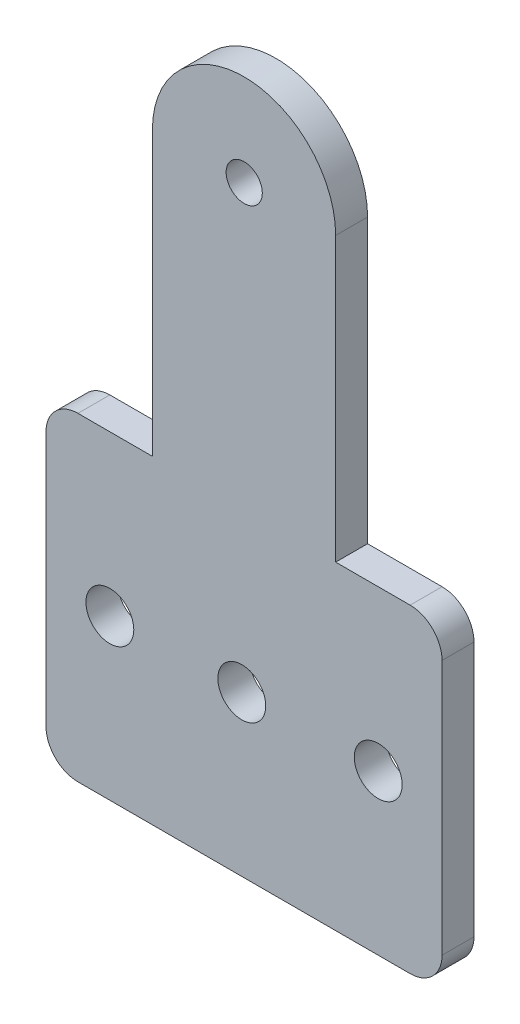
ISO-10303-21;
HEADER;
FILE_DESCRIPTION(('STEP AP214'),'2;1');
FILE_NAME('part.step','',(''),(''),'','','');
FILE_SCHEMA(('AUTOMOTIVE_DESIGN { 1 0 10303 214 1 1 1 1 }'));
ENDSEC;
DATA;
#1=APPLICATION_CONTEXT('core data for automotive mechanical design processes');
#2=APPLICATION_PROTOCOL_DEFINITION('international standard','automotive_design',2000,#1);
#3=PRODUCT_CONTEXT('',#1,'mechanical');
#4=PRODUCT('Part','Part','',(#3));
#5=PRODUCT_RELATED_PRODUCT_CATEGORY('part','',(#4));
#6=PRODUCT_DEFINITION_FORMATION('','',#4);
#7=PRODUCT_DEFINITION_CONTEXT('part definition',#1,'design');
#8=PRODUCT_DEFINITION('design','',#6,#7);
#9=PRODUCT_DEFINITION_SHAPE('','',#8);
#10=(LENGTH_UNIT() NAMED_UNIT(*) SI_UNIT(.MILLI.,.METRE.));
#11=(NAMED_UNIT(*) PLANE_ANGLE_UNIT() SI_UNIT($,.RADIAN.));
#12=(NAMED_UNIT(*) SI_UNIT($,.STERADIAN.) SOLID_ANGLE_UNIT());
#13=UNCERTAINTY_MEASURE_WITH_UNIT(LENGTH_MEASURE(1.E-05),#10,'distance_accuracy_value','');
#14=(GEOMETRIC_REPRESENTATION_CONTEXT(3) GLOBAL_UNCERTAINTY_ASSIGNED_CONTEXT((#13)) GLOBAL_UNIT_ASSIGNED_CONTEXT((#10,
#11,#12)) REPRESENTATION_CONTEXT('',''));
#15=CARTESIAN_POINT('',(0.,0.,0.));
#16=DIRECTION('',(0.,0.,1.));
#17=DIRECTION('',(1.,0.,0.));
#18=AXIS2_PLACEMENT_3D('',#15,#16,#17);
#19=CARTESIAN_POINT('',(78.0000000000004,-14.9999999999999,3.));
#20=DIRECTION('',(-1.,0.,0.));
#21=DIRECTION('',(0.,-1.,0.));
#22=AXIS2_PLACEMENT_3D('',#19,#20,#21);
#23=PLANE('',#22);
#24=DIRECTION('',(0.,1.,0.));
#25=VECTOR('',#24,1.);
#26=CARTESIAN_POINT('',(78.0000000000004,-14.9999999999999,3.));
#27=LINE('',#26,#25);
#28=CARTESIAN_POINT('',(78.0000000000004,-11.9999999999999,3.));
#29=VERTEX_POINT('',#28);
#30=CARTESIAN_POINT('',(78.0000000000004,11.9999999999999,3.));
#31=VERTEX_POINT('',#30);
#32=EDGE_CURVE('E137',#29,#31,#27,.T.);
#33=ORIENTED_EDGE('',*,*,#32,.F.);
#34=DIRECTION('',(0.,0.,-1.));
#35=VECTOR('',#34,1.);
#36=CARTESIAN_POINT('',(78.0000000000004,-11.9999999999999,3.));
#37=LINE('',#36,#35);
#38=CARTESIAN_POINT('',(78.0000000000004,-11.9999999999999,0.));
#39=VERTEX_POINT('',#38);
#40=EDGE_CURVE('E192',#29,#39,#37,.T.);
#41=ORIENTED_EDGE('',*,*,#40,.T.);
#42=DIRECTION('',(0.,1.,0.));
#43=VECTOR('',#42,1.);
#44=CARTESIAN_POINT('',(78.0000000000004,-14.9999999999999,0.));
#45=LINE('',#44,#43);
#46=CARTESIAN_POINT('',(78.0000000000004,11.9999999999999,0.));
#47=VERTEX_POINT('',#46);
#48=EDGE_CURVE('E166',#39,#47,#45,.T.);
#49=ORIENTED_EDGE('',*,*,#48,.T.);
#50=DIRECTION('',(0.,0.,-1.));
#51=VECTOR('',#50,1.);
#52=CARTESIAN_POINT('',(78.0000000000004,11.9999999999999,3.));
#53=LINE('',#52,#51);
#54=EDGE_CURVE('E146',#47,#31,#53,.F.);
#55=ORIENTED_EDGE('',*,*,#54,.T.);
#56=EDGE_LOOP('',(#33,#41,#49,#55));
#57=FACE_BOUND('',#56,.T.);
#58=ADVANCED_FACE('F36',(#57),#23,.F.);
#59=CARTESIAN_POINT('',(78.0000000000004,14.9999999999999,3.));
#60=DIRECTION('',(0.,-1.,0.));
#61=DIRECTION('',(1.,0.,0.));
#62=AXIS2_PLACEMENT_3D('',#59,#60,#61);
#63=PLANE('',#62);
#64=DIRECTION('',(-1.,0.,0.));
#65=VECTOR('',#64,1.);
#66=CARTESIAN_POINT('',(78.0000000000004,14.9999999999999,3.));
#67=LINE('',#66,#65);
#68=CARTESIAN_POINT('',(75.0000000000004,14.9999999999999,3.));
#69=VERTEX_POINT('',#68);
#70=CARTESIAN_POINT('',(68.0000000000001,15.,3.));
#71=VERTEX_POINT('',#70);
#72=EDGE_CURVE('E125',#69,#71,#67,.T.);
#73=ORIENTED_EDGE('',*,*,#72,.F.);
#74=DIRECTION('',(0.,0.,-1.));
#75=VECTOR('',#74,1.);
#76=CARTESIAN_POINT('',(75.0000000000004,14.9999999999999,3.));
#77=LINE('',#76,#75);
#78=CARTESIAN_POINT('',(75.0000000000004,14.9999999999999,0.));
#79=VERTEX_POINT('',#78);
#80=EDGE_CURVE('E11',#69,#79,#77,.T.);
#81=ORIENTED_EDGE('',*,*,#80,.T.);
#82=DIRECTION('',(-1.,0.,0.));
#83=VECTOR('',#82,1.);
#84=CARTESIAN_POINT('',(78.0000000000004,14.9999999999999,0.));
#85=LINE('',#84,#83);
#86=CARTESIAN_POINT('',(68.0000000000001,15.,0.));
#87=VERTEX_POINT('',#86);
#88=EDGE_CURVE('E143',#79,#87,#85,.T.);
#89=ORIENTED_EDGE('',*,*,#88,.T.);
#90=DIRECTION('',(0.,0.,-1.));
#91=VECTOR('',#90,1.);
#92=CARTESIAN_POINT('',(68.0000000000001,15.,3.));
#93=LINE('',#92,#91);
#94=EDGE_CURVE('E140',#71,#87,#93,.T.);
#95=ORIENTED_EDGE('',*,*,#94,.F.);
#96=EDGE_LOOP('',(#73,#81,#89,#95));
#97=FACE_BOUND('',#96,.T.);
#98=ADVANCED_FACE('F141',(#97),#63,.F.);
#99=CARTESIAN_POINT('',(68.0000000000001,15.,3.));
#100=DIRECTION('',(-1.,0.,0.));
#101=DIRECTION('',(0.,-1.,0.));
#102=AXIS2_PLACEMENT_3D('',#99,#100,#101);
#103=PLANE('',#102);
#104=DIRECTION('',(0.,1.,0.));
#105=VECTOR('',#104,1.);
#106=CARTESIAN_POINT('',(68.0000000000001,15.,0.));
#107=LINE('',#106,#105);
#108=CARTESIAN_POINT('',(68.0000000000001,41.5958,0.));
#109=VERTEX_POINT('',#108);
#110=EDGE_CURVE('E171',#87,#109,#107,.T.);
#111=ORIENTED_EDGE('',*,*,#110,.T.);
#112=DIRECTION('',(0.,0.,-1.));
#113=VECTOR('',#112,1.);
#114=CARTESIAN_POINT('',(68.0000000000001,41.5958,3.));
#115=LINE('',#114,#113);
#116=CARTESIAN_POINT('',(68.0000000000001,41.5958,3.));
#117=VERTEX_POINT('',#116);
#118=EDGE_CURVE('E147',#117,#109,#115,.T.);
#119=ORIENTED_EDGE('',*,*,#118,.F.);
#120=DIRECTION('',(0.,1.,0.));
#121=VECTOR('',#120,1.);
#122=CARTESIAN_POINT('',(68.0000000000001,15.,3.));
#123=LINE('',#122,#121);
#124=EDGE_CURVE('E130',#71,#117,#123,.T.);
#125=ORIENTED_EDGE('',*,*,#124,.F.);
#126=ORIENTED_EDGE('',*,*,#94,.T.);
#127=EDGE_LOOP('',(#111,#119,#125,#126));
#128=FACE_BOUND('',#127,.T.);
#129=ADVANCED_FACE('F149',(#128),#103,.F.);
#130=CARTESIAN_POINT('',(59.386891496535,41.5958,3.));
#131=DIRECTION('',(0.,0.,-1.));
#132=DIRECTION('',(-1.,0.,0.));
#133=AXIS2_PLACEMENT_3D('',#130,#131,#132);
#134=CYLINDRICAL_SURFACE('',#133,8.61310850346502);
#135=CARTESIAN_POINT('',(59.386891496535,41.5958,0.));
#136=DIRECTION('',(0.,0.,1.));
#137=DIRECTION('',(1.,0.,0.));
#138=AXIS2_PLACEMENT_3D('',#135,#136,#137);
#139=CIRCLE('',#138,8.61310850346502);
#140=CARTESIAN_POINT('',(50.77378299307,41.5958,0.));
#141=VERTEX_POINT('',#140);
#142=EDGE_CURVE('E173',#109,#141,#139,.T.);
#143=ORIENTED_EDGE('',*,*,#142,.T.);
#144=DIRECTION('',(0.,0.,-1.));
#145=VECTOR('',#144,1.);
#146=CARTESIAN_POINT('',(50.77378299307,41.5958,3.));
#147=LINE('',#146,#145);
#148=CARTESIAN_POINT('',(50.77378299307,41.5958,3.));
#149=VERTEX_POINT('',#148);
#150=EDGE_CURVE('E187',#149,#141,#147,.T.);
#151=ORIENTED_EDGE('',*,*,#150,.F.);
#152=CARTESIAN_POINT('',(59.386891496535,41.5958,3.));
#153=DIRECTION('',(0.,0.,1.));
#154=DIRECTION('',(1.,0.,0.));
#155=AXIS2_PLACEMENT_3D('',#152,#153,#154);
#156=CIRCLE('',#155,8.61310850346502);
#157=EDGE_CURVE('E152',#117,#149,#156,.T.);
#158=ORIENTED_EDGE('',*,*,#157,.F.);
#159=ORIENTED_EDGE('',*,*,#118,.T.);
#160=EDGE_LOOP('',(#143,#151,#158,#159));
#161=FACE_BOUND('',#160,.T.);
#162=ADVANCED_FACE('F419',(#161),#134,.T.);
#163=CARTESIAN_POINT('',(50.7737829930701,14.9999999999999,3.));
#164=DIRECTION('',(1.,0.,0.));
#165=DIRECTION('',(0.,1.,0.));
#166=AXIS2_PLACEMENT_3D('',#163,#164,#165);
#167=PLANE('',#166);
#168=DIRECTION('',(0.,-1.,0.));
#169=VECTOR('',#168,1.);
#170=CARTESIAN_POINT('',(50.7737829930701,14.9999999999999,0.));
#171=LINE('',#170,#169);
#172=CARTESIAN_POINT('',(50.7737829930701,14.9999999999999,0.));
#173=VERTEX_POINT('',#172);
#174=EDGE_CURVE('E175',#141,#173,#171,.T.);
#175=ORIENTED_EDGE('',*,*,#174,.T.);
#176=DIRECTION('',(0.,0.,-1.));
#177=VECTOR('',#176,1.);
#178=CARTESIAN_POINT('',(50.7737829930701,14.9999999999999,3.));
#179=LINE('',#178,#177);
#180=CARTESIAN_POINT('',(50.7737829930701,14.9999999999999,3.));
#181=VERTEX_POINT('',#180);
#182=EDGE_CURVE('E165',#181,#173,#179,.T.);
#183=ORIENTED_EDGE('',*,*,#182,.F.);
#184=DIRECTION('',(0.,-1.,0.));
#185=VECTOR('',#184,1.);
#186=CARTESIAN_POINT('',(50.7737829930701,14.9999999999999,3.));
#187=LINE('',#186,#185);
#188=EDGE_CURVE('E154',#149,#181,#187,.T.);
#189=ORIENTED_EDGE('',*,*,#188,.F.);
#190=ORIENTED_EDGE('',*,*,#150,.T.);
#191=EDGE_LOOP('',(#175,#183,#189,#190));
#192=FACE_BOUND('',#191,.T.);
#193=ADVANCED_FACE('F373',(#192),#167,.F.);
#194=CARTESIAN_POINT('',(50.7737829930701,14.9999999999999,3.));
#195=DIRECTION('',(0.,-1.,0.));
#196=DIRECTION('',(1.,0.,0.));
#197=AXIS2_PLACEMENT_3D('',#194,#195,#196);
#198=PLANE('',#197);
#199=DIRECTION('',(-1.,0.,0.));
#200=VECTOR('',#199,1.);
#201=CARTESIAN_POINT('',(50.7737829930701,14.9999999999999,0.));
#202=LINE('',#201,#200);
#203=CARTESIAN_POINT('',(43.7737829930697,14.9999999999999,0.));
#204=VERTEX_POINT('',#203);
#205=EDGE_CURVE('E177',#173,#204,#202,.T.);
#206=ORIENTED_EDGE('',*,*,#205,.T.);
#207=DIRECTION('',(0.,0.,-1.));
#208=VECTOR('',#207,1.);
#209=CARTESIAN_POINT('',(43.7737829930697,14.9999999999999,3.));
#210=LINE('',#209,#208);
#211=CARTESIAN_POINT('',(43.7737829930697,14.9999999999999,3.));
#212=VERTEX_POINT('',#211);
#213=EDGE_CURVE('E44',#204,#212,#210,.F.);
#214=ORIENTED_EDGE('',*,*,#213,.T.);
#215=DIRECTION('',(-1.,0.,0.));
#216=VECTOR('',#215,1.);
#217=CARTESIAN_POINT('',(50.7737829930701,14.9999999999999,3.));
#218=LINE('',#217,#216);
#219=EDGE_CURVE('E159',#181,#212,#218,.T.);
#220=ORIENTED_EDGE('',*,*,#219,.F.);
#221=ORIENTED_EDGE('',*,*,#182,.T.);
#222=EDGE_LOOP('',(#206,#214,#220,#221));
#223=FACE_BOUND('',#222,.T.);
#224=ADVANCED_FACE('F220',(#223),#198,.F.);
#225=CARTESIAN_POINT('',(40.7737829930697,-14.9999999999999,3.));
#226=DIRECTION('',(1.,0.,0.));
#227=DIRECTION('',(0.,0.,-1.));
#228=AXIS2_PLACEMENT_3D('',#225,#226,#227);
#229=PLANE('',#228);
#230=DIRECTION('',(0.,-1.,0.));
#231=VECTOR('',#230,1.);
#232=CARTESIAN_POINT('',(40.7737829930697,-14.9999999999999,0.));
#233=LINE('',#232,#231);
#234=CARTESIAN_POINT('',(40.7737829930697,11.9999999999999,0.));
#235=VERTEX_POINT('',#234);
#236=CARTESIAN_POINT('',(40.7737829930697,-11.9999999999999,0.));
#237=VERTEX_POINT('',#236);
#238=EDGE_CURVE('E180',#235,#237,#233,.T.);
#239=ORIENTED_EDGE('',*,*,#238,.T.);
#240=DIRECTION('',(0.,0.,-1.));
#241=VECTOR('',#240,1.);
#242=CARTESIAN_POINT('',(40.7737829930697,-11.9999999999999,3.));
#243=LINE('',#242,#241);
#244=CARTESIAN_POINT('',(40.7737829930697,-11.9999999999999,3.));
#245=VERTEX_POINT('',#244);
#246=EDGE_CURVE('E51',#237,#245,#243,.F.);
#247=ORIENTED_EDGE('',*,*,#246,.T.);
#248=DIRECTION('',(0.,-1.,0.));
#249=VECTOR('',#248,1.);
#250=CARTESIAN_POINT('',(40.7737829930697,-14.9999999999999,3.));
#251=LINE('',#250,#249);
#252=CARTESIAN_POINT('',(40.7737829930697,11.9999999999999,3.));
#253=VERTEX_POINT('',#252);
#254=EDGE_CURVE('E161',#253,#245,#251,.T.);
#255=ORIENTED_EDGE('',*,*,#254,.F.);
#256=DIRECTION('',(0.,0.,-1.));
#257=VECTOR('',#256,1.);
#258=CARTESIAN_POINT('',(40.7737829930697,11.9999999999999,3.));
#259=LINE('',#258,#257);
#260=EDGE_CURVE('E214',#253,#235,#259,.T.);
#261=ORIENTED_EDGE('',*,*,#260,.T.);
#262=EDGE_LOOP('',(#239,#247,#255,#261));
#263=FACE_BOUND('',#262,.T.);
#264=ADVANCED_FACE('F228',(#263),#229,.F.);
#265=CARTESIAN_POINT('',(78.0000000000004,-14.9999999999999,3.));
#266=DIRECTION('',(0.,1.,0.));
#267=DIRECTION('',(-1.,0.,0.));
#268=AXIS2_PLACEMENT_3D('',#265,#266,#267);
#269=PLANE('',#268);
#270=DIRECTION('',(1.,0.,0.));
#271=VECTOR('',#270,1.);
#272=CARTESIAN_POINT('',(78.0000000000004,-14.9999999999999,0.));
#273=LINE('',#272,#271);
#274=CARTESIAN_POINT('',(43.7737829930697,-14.9999999999999,0.));
#275=VERTEX_POINT('',#274);
#276=CARTESIAN_POINT('',(75.0000000000004,-14.9999999999999,0.));
#277=VERTEX_POINT('',#276);
#278=EDGE_CURVE('E182',#275,#277,#273,.T.);
#279=ORIENTED_EDGE('',*,*,#278,.T.);
#280=DIRECTION('',(0.,0.,-1.));
#281=VECTOR('',#280,1.);
#282=CARTESIAN_POINT('',(75.0000000000004,-14.9999999999999,3.));
#283=LINE('',#282,#281);
#284=CARTESIAN_POINT('',(75.0000000000004,-14.9999999999999,3.));
#285=VERTEX_POINT('',#284);
#286=EDGE_CURVE('E206',#277,#285,#283,.F.);
#287=ORIENTED_EDGE('',*,*,#286,.T.);
#288=DIRECTION('',(1.,0.,0.));
#289=VECTOR('',#288,1.);
#290=CARTESIAN_POINT('',(78.0000000000004,-14.9999999999999,3.));
#291=LINE('',#290,#289);
#292=CARTESIAN_POINT('',(43.7737829930697,-14.9999999999999,3.));
#293=VERTEX_POINT('',#292);
#294=EDGE_CURVE('E163',#293,#285,#291,.T.);
#295=ORIENTED_EDGE('',*,*,#294,.F.);
#296=DIRECTION('',(0.,0.,-1.));
#297=VECTOR('',#296,1.);
#298=CARTESIAN_POINT('',(43.7737829930697,-14.9999999999999,3.));
#299=LINE('',#298,#297);
#300=EDGE_CURVE('E203',#293,#275,#299,.T.);
#301=ORIENTED_EDGE('',*,*,#300,.T.);
#302=EDGE_LOOP('',(#279,#287,#295,#301));
#303=FACE_BOUND('',#302,.T.);
#304=ADVANCED_FACE('F239',(#303),#269,.F.);
#305=CARTESIAN_POINT('',(59.386891496535,41.5958,3.));
#306=DIRECTION('',(0.,0.,1.));
#307=DIRECTION('',(1.,0.,0.));
#308=AXIS2_PLACEMENT_3D('',#305,#306,#307);
#309=PLANE('',#308);
#310=CARTESIAN_POINT('',(46.7737829930697,0.,3.));
#311=DIRECTION('',(0.,0.,1.));
#312=DIRECTION('',(1.,0.,0.));
#313=AXIS2_PLACEMENT_3D('',#310,#311,#312);
#314=CIRCLE('',#313,2.24999999999999);
#315=CARTESIAN_POINT('',(49.0237829930697,0.,3.));
#316=VERTEX_POINT('',#315);
#317=EDGE_CURVE('E270',#316,#316,#314,.T.);
#318=ORIENTED_EDGE('',*,*,#317,.F.);
#319=EDGE_LOOP('',(#318));
#320=FACE_BOUND('',#319,.T.);
#321=CARTESIAN_POINT('',(72.0000000000004,0.,3.));
#322=DIRECTION('',(0.,0.,1.));
#323=DIRECTION('',(1.,0.,0.));
#324=AXIS2_PLACEMENT_3D('',#321,#322,#323);
#325=CIRCLE('',#324,2.24999999999999);
#326=CARTESIAN_POINT('',(74.2500000000004,0.,3.));
#327=VERTEX_POINT('',#326);
#328=EDGE_CURVE('E264',#327,#327,#325,.T.);
#329=ORIENTED_EDGE('',*,*,#328,.F.);
#330=EDGE_LOOP('',(#329));
#331=FACE_BOUND('',#330,.T.);
#332=CARTESIAN_POINT('',(59.1771200778858,0.,3.));
#333=DIRECTION('',(0.,0.,1.));
#334=DIRECTION('',(1.,0.,0.));
#335=AXIS2_PLACEMENT_3D('',#332,#333,#334);
#336=CIRCLE('',#335,2.24999999999999);
#337=CARTESIAN_POINT('',(61.4271200778858,0.,3.));
#338=VERTEX_POINT('',#337);
#339=EDGE_CURVE('E258',#338,#338,#336,.T.);
#340=ORIENTED_EDGE('',*,*,#339,.F.);
#341=EDGE_LOOP('',(#340));
#342=FACE_BOUND('',#341,.T.);
#343=CARTESIAN_POINT('',(59.4035093402812,41.5958,3.));
#344=DIRECTION('',(0.,0.,1.));
#345=DIRECTION('',(1.,0.,0.));
#346=AXIS2_PLACEMENT_3D('',#343,#344,#345);
#347=CIRCLE('',#346,1.7);
#348=CARTESIAN_POINT('',(61.1035093402812,41.5958,3.));
#349=VERTEX_POINT('',#348);
#350=EDGE_CURVE('E252',#349,#349,#347,.T.);
#351=ORIENTED_EDGE('',*,*,#350,.F.);
#352=EDGE_LOOP('',(#351));
#353=FACE_BOUND('',#352,.T.);
#354=ORIENTED_EDGE('',*,*,#294,.T.);
#355=CARTESIAN_POINT('',(75.0000000000004,-11.9999999999999,3.));
#356=DIRECTION('',(0.,0.,1.));
#357=DIRECTION('',(1.,0.,0.));
#358=AXIS2_PLACEMENT_3D('',#355,#356,#357);
#359=CIRCLE('',#358,3.);
#360=EDGE_CURVE('E212',#285,#29,#359,.T.);
#361=ORIENTED_EDGE('',*,*,#360,.T.);
#362=ORIENTED_EDGE('',*,*,#32,.T.);
#363=CARTESIAN_POINT('',(75.0000000000004,11.9999999999999,3.));
#364=DIRECTION('',(0.,0.,1.));
#365=DIRECTION('',(1.,0.,0.));
#366=AXIS2_PLACEMENT_3D('',#363,#364,#365);
#367=CIRCLE('',#366,3.);
#368=EDGE_CURVE('E134',#31,#69,#367,.T.);
#369=ORIENTED_EDGE('',*,*,#368,.T.);
#370=ORIENTED_EDGE('',*,*,#72,.T.);
#371=ORIENTED_EDGE('',*,*,#124,.T.);
#372=ORIENTED_EDGE('',*,*,#157,.T.);
#373=ORIENTED_EDGE('',*,*,#188,.T.);
#374=ORIENTED_EDGE('',*,*,#219,.T.);
#375=CARTESIAN_POINT('',(43.7737829930697,11.9999999999999,3.));
#376=DIRECTION('',(0.,0.,1.));
#377=DIRECTION('',(1.,0.,0.));
#378=AXIS2_PLACEMENT_3D('',#375,#376,#377);
#379=CIRCLE('',#378,3.);
#380=EDGE_CURVE('E58',#212,#253,#379,.T.);
#381=ORIENTED_EDGE('',*,*,#380,.T.);
#382=ORIENTED_EDGE('',*,*,#254,.T.);
#383=CARTESIAN_POINT('',(43.7737829930697,-11.9999999999999,3.));
#384=DIRECTION('',(0.,0.,1.));
#385=DIRECTION('',(1.,0.,0.));
#386=AXIS2_PLACEMENT_3D('',#383,#384,#385);
#387=CIRCLE('',#386,3.);
#388=EDGE_CURVE('E210',#245,#293,#387,.T.);
#389=ORIENTED_EDGE('',*,*,#388,.T.);
#390=EDGE_LOOP('',(#354,#361,#362,#369,#370,#371,#372,#373,#374,#381,#382,#389));
#391=FACE_BOUND('',#390,.T.);
#392=ADVANCED_FACE('F128',(#320,#331,#342,#353,#391),#309,.T.);
#393=CARTESIAN_POINT('',(59.386891496535,41.5958,0.));
#394=DIRECTION('',(0.,0.,1.));
#395=DIRECTION('',(1.,0.,0.));
#396=AXIS2_PLACEMENT_3D('',#393,#394,#395);
#397=PLANE('',#396);
#398=CARTESIAN_POINT('',(46.7737829930697,0.,0.));
#399=DIRECTION('',(0.,0.,1.));
#400=DIRECTION('',(1.,0.,0.));
#401=AXIS2_PLACEMENT_3D('',#398,#399,#400);
#402=CIRCLE('',#401,2.24999999999999);
#403=CARTESIAN_POINT('',(49.0237829930697,0.,0.));
#404=VERTEX_POINT('',#403);
#405=EDGE_CURVE('E267',#404,#404,#402,.T.);
#406=ORIENTED_EDGE('',*,*,#405,.T.);
#407=EDGE_LOOP('',(#406));
#408=FACE_BOUND('',#407,.T.);
#409=CARTESIAN_POINT('',(72.0000000000004,0.,0.));
#410=DIRECTION('',(0.,0.,1.));
#411=DIRECTION('',(1.,0.,0.));
#412=AXIS2_PLACEMENT_3D('',#409,#410,#411);
#413=CIRCLE('',#412,2.24999999999999);
#414=CARTESIAN_POINT('',(74.2500000000004,0.,0.));
#415=VERTEX_POINT('',#414);
#416=EDGE_CURVE('E261',#415,#415,#413,.T.);
#417=ORIENTED_EDGE('',*,*,#416,.T.);
#418=EDGE_LOOP('',(#417));
#419=FACE_BOUND('',#418,.T.);
#420=CARTESIAN_POINT('',(59.1771200778858,0.,0.));
#421=DIRECTION('',(0.,0.,1.));
#422=DIRECTION('',(1.,0.,0.));
#423=AXIS2_PLACEMENT_3D('',#420,#421,#422);
#424=CIRCLE('',#423,2.24999999999999);
#425=CARTESIAN_POINT('',(61.4271200778858,0.,0.));
#426=VERTEX_POINT('',#425);
#427=EDGE_CURVE('E255',#426,#426,#424,.T.);
#428=ORIENTED_EDGE('',*,*,#427,.T.);
#429=EDGE_LOOP('',(#428));
#430=FACE_BOUND('',#429,.T.);
#431=CARTESIAN_POINT('',(59.4035093402812,41.5958,0.));
#432=DIRECTION('',(0.,0.,1.));
#433=DIRECTION('',(1.,0.,0.));
#434=AXIS2_PLACEMENT_3D('',#431,#432,#433);
#435=CIRCLE('',#434,1.7);
#436=CARTESIAN_POINT('',(61.1035093402812,41.5958,0.));
#437=VERTEX_POINT('',#436);
#438=EDGE_CURVE('E169',#437,#437,#435,.T.);
#439=ORIENTED_EDGE('',*,*,#438,.T.);
#440=EDGE_LOOP('',(#439));
#441=FACE_BOUND('',#440,.T.);
#442=ORIENTED_EDGE('',*,*,#48,.F.);
#443=CARTESIAN_POINT('',(75.0000000000004,-11.9999999999999,0.));
#444=DIRECTION('',(0.,0.,1.));
#445=DIRECTION('',(1.,0.,0.));
#446=AXIS2_PLACEMENT_3D('',#443,#444,#445);
#447=CIRCLE('',#446,3.);
#448=EDGE_CURVE('E201',#39,#277,#447,.F.);
#449=ORIENTED_EDGE('',*,*,#448,.T.);
#450=ORIENTED_EDGE('',*,*,#278,.F.);
#451=CARTESIAN_POINT('',(43.7737829930697,-11.9999999999999,0.));
#452=DIRECTION('',(0.,0.,1.));
#453=DIRECTION('',(1.,0.,0.));
#454=AXIS2_PLACEMENT_3D('',#451,#452,#453);
#455=CIRCLE('',#454,3.);
#456=EDGE_CURVE('E199',#275,#237,#455,.F.);
#457=ORIENTED_EDGE('',*,*,#456,.T.);
#458=ORIENTED_EDGE('',*,*,#238,.F.);
#459=CARTESIAN_POINT('',(43.7737829930697,11.9999999999999,0.));
#460=DIRECTION('',(0.,0.,1.));
#461=DIRECTION('',(1.,0.,0.));
#462=AXIS2_PLACEMENT_3D('',#459,#460,#461);
#463=CIRCLE('',#462,3.);
#464=EDGE_CURVE('E197',#235,#204,#463,.F.);
#465=ORIENTED_EDGE('',*,*,#464,.T.);
#466=ORIENTED_EDGE('',*,*,#205,.F.);
#467=ORIENTED_EDGE('',*,*,#174,.F.);
#468=ORIENTED_EDGE('',*,*,#142,.F.);
#469=ORIENTED_EDGE('',*,*,#110,.F.);
#470=ORIENTED_EDGE('',*,*,#88,.F.);
#471=CARTESIAN_POINT('',(75.0000000000004,11.9999999999999,0.));
#472=DIRECTION('',(0.,0.,1.));
#473=DIRECTION('',(1.,0.,0.));
#474=AXIS2_PLACEMENT_3D('',#471,#472,#473);
#475=CIRCLE('',#474,3.);
#476=EDGE_CURVE('E195',#79,#47,#475,.F.);
#477=ORIENTED_EDGE('',*,*,#476,.T.);
#478=EDGE_LOOP('',(#442,#449,#450,#457,#458,#465,#466,#467,#468,#469,#470,#477));
#479=FACE_BOUND('',#478,.T.);
#480=ADVANCED_FACE('F231',(#408,#419,#430,#441,#479),#397,.F.);
#481=CARTESIAN_POINT('',(59.4035093402812,41.5958,3.));
#482=DIRECTION('',(0.,0.,1.));
#483=DIRECTION('',(1.,0.,0.));
#484=AXIS2_PLACEMENT_3D('',#481,#482,#483);
#485=CYLINDRICAL_SURFACE('',#484,1.7);
#486=ORIENTED_EDGE('',*,*,#438,.F.);
#487=EDGE_LOOP('',(#486));
#488=FACE_BOUND('',#487,.T.);
#489=ORIENTED_EDGE('',*,*,#350,.T.);
#490=EDGE_LOOP('',(#489));
#491=FACE_BOUND('',#490,.T.);
#492=ADVANCED_FACE('F285',(#488,#491),#485,.F.);
#493=CARTESIAN_POINT('',(59.1771200778858,0.,3.));
#494=DIRECTION('',(0.,0.,1.));
#495=DIRECTION('',(1.,0.,0.));
#496=AXIS2_PLACEMENT_3D('',#493,#494,#495);
#497=CYLINDRICAL_SURFACE('',#496,2.24999999999999);
#498=ORIENTED_EDGE('',*,*,#427,.F.);
#499=EDGE_LOOP('',(#498));
#500=FACE_BOUND('',#499,.T.);
#501=ORIENTED_EDGE('',*,*,#339,.T.);
#502=EDGE_LOOP('',(#501));
#503=FACE_BOUND('',#502,.T.);
#504=ADVANCED_FACE('F287',(#500,#503),#497,.F.);
#505=CARTESIAN_POINT('',(72.0000000000004,0.,3.));
#506=DIRECTION('',(0.,0.,1.));
#507=DIRECTION('',(1.,0.,0.));
#508=AXIS2_PLACEMENT_3D('',#505,#506,#507);
#509=CYLINDRICAL_SURFACE('',#508,2.24999999999999);
#510=ORIENTED_EDGE('',*,*,#416,.F.);
#511=EDGE_LOOP('',(#510));
#512=FACE_BOUND('',#511,.T.);
#513=ORIENTED_EDGE('',*,*,#328,.T.);
#514=EDGE_LOOP('',(#513));
#515=FACE_BOUND('',#514,.T.);
#516=ADVANCED_FACE('F294',(#512,#515),#509,.F.);
#517=CARTESIAN_POINT('',(46.7737829930697,0.,3.));
#518=DIRECTION('',(0.,0.,1.));
#519=DIRECTION('',(1.,0.,0.));
#520=AXIS2_PLACEMENT_3D('',#517,#518,#519);
#521=CYLINDRICAL_SURFACE('',#520,2.24999999999999);
#522=ORIENTED_EDGE('',*,*,#405,.F.);
#523=EDGE_LOOP('',(#522));
#524=FACE_BOUND('',#523,.T.);
#525=ORIENTED_EDGE('',*,*,#317,.T.);
#526=EDGE_LOOP('',(#525));
#527=FACE_BOUND('',#526,.T.);
#528=ADVANCED_FACE('F274',(#524,#527),#521,.F.);
#529=CARTESIAN_POINT('',(75.0000000000004,-11.9999999999999,3.));
#530=DIRECTION('',(0.,0.,-1.));
#531=DIRECTION('',(-1.,0.,0.));
#532=AXIS2_PLACEMENT_3D('',#529,#530,#531);
#533=CYLINDRICAL_SURFACE('',#532,3.);
#534=ORIENTED_EDGE('',*,*,#360,.F.);
#535=ORIENTED_EDGE('',*,*,#286,.F.);
#536=ORIENTED_EDGE('',*,*,#448,.F.);
#537=ORIENTED_EDGE('',*,*,#40,.F.);
#538=EDGE_LOOP('',(#534,#535,#536,#537));
#539=FACE_BOUND('',#538,.T.);
#540=ADVANCED_FACE('F245',(#539),#533,.T.);
#541=CARTESIAN_POINT('',(43.7737829930697,-11.9999999999999,3.));
#542=DIRECTION('',(0.,0.,-1.));
#543=DIRECTION('',(-1.,0.,0.));
#544=AXIS2_PLACEMENT_3D('',#541,#542,#543);
#545=CYLINDRICAL_SURFACE('',#544,3.);
#546=ORIENTED_EDGE('',*,*,#388,.F.);
#547=ORIENTED_EDGE('',*,*,#246,.F.);
#548=ORIENTED_EDGE('',*,*,#456,.F.);
#549=ORIENTED_EDGE('',*,*,#300,.F.);
#550=EDGE_LOOP('',(#546,#547,#548,#549));
#551=FACE_BOUND('',#550,.T.);
#552=ADVANCED_FACE('F236',(#551),#545,.T.);
#553=CARTESIAN_POINT('',(43.7737829930697,11.9999999999999,3.));
#554=DIRECTION('',(0.,0.,-1.));
#555=DIRECTION('',(-1.,0.,0.));
#556=AXIS2_PLACEMENT_3D('',#553,#554,#555);
#557=CYLINDRICAL_SURFACE('',#556,3.);
#558=ORIENTED_EDGE('',*,*,#380,.F.);
#559=ORIENTED_EDGE('',*,*,#213,.F.);
#560=ORIENTED_EDGE('',*,*,#464,.F.);
#561=ORIENTED_EDGE('',*,*,#260,.F.);
#562=EDGE_LOOP('',(#558,#559,#560,#561));
#563=FACE_BOUND('',#562,.T.);
#564=ADVANCED_FACE('F226',(#563),#557,.T.);
#565=CARTESIAN_POINT('',(75.0000000000004,11.9999999999999,3.));
#566=DIRECTION('',(0.,0.,-1.));
#567=DIRECTION('',(-1.,0.,0.));
#568=AXIS2_PLACEMENT_3D('',#565,#566,#567);
#569=CYLINDRICAL_SURFACE('',#568,3.);
#570=ORIENTED_EDGE('',*,*,#368,.F.);
#571=ORIENTED_EDGE('',*,*,#54,.F.);
#572=ORIENTED_EDGE('',*,*,#476,.F.);
#573=ORIENTED_EDGE('',*,*,#80,.F.);
#574=EDGE_LOOP('',(#570,#571,#572,#573));
#575=FACE_BOUND('',#574,.T.);
#576=ADVANCED_FACE('F38',(#575),#569,.T.);
#577=CLOSED_SHELL('',(#58,#98,#129,#162,#193,#224,#264,#304,#392,#480,#492,#504,#516,#528,#540,
#552,#564,#576));
#578=MANIFOLD_SOLID_BREP('B2',#577);
#579=ADVANCED_BREP_SHAPE_REPRESENTATION('',(#18,#578),#14);
#580=SHAPE_DEFINITION_REPRESENTATION(#9,#579);
ENDSEC;
END-ISO-10303-21;
